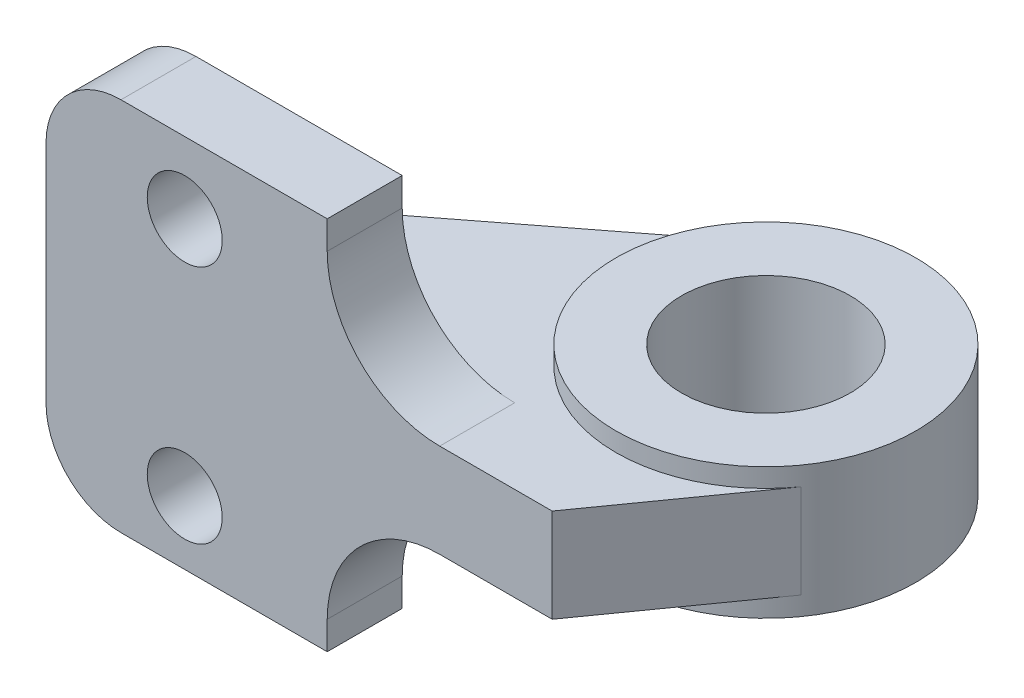
ISO-10303-21;
HEADER;
FILE_DESCRIPTION(('STEP AP214'),'2;1');
FILE_NAME('part.step','',(''),(''),'','','');
FILE_SCHEMA(('AUTOMOTIVE_DESIGN { 1 0 10303 214 1 1 1 1 }'));
ENDSEC;
DATA;
#1=APPLICATION_CONTEXT('core data for automotive mechanical design processes');
#2=APPLICATION_PROTOCOL_DEFINITION('international standard','automotive_design',2000,#1);
#3=PRODUCT_CONTEXT('',#1,'mechanical');
#4=PRODUCT('Part','Part','',(#3));
#5=PRODUCT_RELATED_PRODUCT_CATEGORY('part','',(#4));
#6=PRODUCT_DEFINITION_FORMATION('','',#4);
#7=PRODUCT_DEFINITION_CONTEXT('part definition',#1,'design');
#8=PRODUCT_DEFINITION('design','',#6,#7);
#9=PRODUCT_DEFINITION_SHAPE('','',#8);
#10=(LENGTH_UNIT() NAMED_UNIT(*) SI_UNIT(.MILLI.,.METRE.));
#11=(NAMED_UNIT(*) PLANE_ANGLE_UNIT() SI_UNIT($,.RADIAN.));
#12=(NAMED_UNIT(*) SI_UNIT($,.STERADIAN.) SOLID_ANGLE_UNIT());
#13=UNCERTAINTY_MEASURE_WITH_UNIT(LENGTH_MEASURE(1.E-05),#10,'distance_accuracy_value','');
#14=(GEOMETRIC_REPRESENTATION_CONTEXT(3) GLOBAL_UNCERTAINTY_ASSIGNED_CONTEXT((#13)) GLOBAL_UNIT_ASSIGNED_CONTEXT((#10,
#11,#12)) REPRESENTATION_CONTEXT('',''));
#15=CARTESIAN_POINT('',(0.,0.,0.));
#16=DIRECTION('',(0.,0.,1.));
#17=DIRECTION('',(1.,0.,0.));
#18=AXIS2_PLACEMENT_3D('',#15,#16,#17);
#19=CARTESIAN_POINT('',(37.5,0.,20.));
#20=DIRECTION('',(-1.,0.,0.));
#21=DIRECTION('',(0.,0.,1.));
#22=AXIS2_PLACEMENT_3D('',#19,#20,#21);
#23=PLANE('',#22);
#24=DIRECTION('',(0.,1.,0.));
#25=VECTOR('',#24,1.);
#26=CARTESIAN_POINT('',(37.5,50.,0.));
#27=LINE('',#26,#25);
#28=CARTESIAN_POINT('',(37.5,-50.,0.));
#29=VERTEX_POINT('',#28);
#30=CARTESIAN_POINT('',(37.5,-42.5,0.));
#31=VERTEX_POINT('',#30);
#32=EDGE_CURVE('E200',#29,#31,#27,.T.);
#33=ORIENTED_EDGE('',*,*,#32,.T.);
#34=DIRECTION('',(0.,0.,1.));
#35=VECTOR('',#34,1.);
#36=CARTESIAN_POINT('',(37.5,-42.5,20.));
#37=LINE('',#36,#35);
#38=CARTESIAN_POINT('',(37.5,-42.5,20.));
#39=VERTEX_POINT('',#38);
#40=EDGE_CURVE('E247',#31,#39,#37,.T.);
#41=ORIENTED_EDGE('',*,*,#40,.T.);
#42=DIRECTION('',(0.,1.,0.));
#43=VECTOR('',#42,1.);
#44=CARTESIAN_POINT('',(37.5,0.,20.));
#45=LINE('',#44,#43);
#46=CARTESIAN_POINT('',(37.5,-50.,20.));
#47=VERTEX_POINT('',#46);
#48=EDGE_CURVE('E181',#47,#39,#45,.T.);
#49=ORIENTED_EDGE('',*,*,#48,.F.);
#50=DIRECTION('',(0.,0.,-1.));
#51=VECTOR('',#50,1.);
#52=CARTESIAN_POINT('',(37.5,-50.,20.));
#53=LINE('',#52,#51);
#54=EDGE_CURVE('E199',#47,#29,#53,.T.);
#55=ORIENTED_EDGE('',*,*,#54,.T.);
#56=EDGE_LOOP('',(#33,#41,#49,#55));
#57=FACE_BOUND('',#56,.T.);
#58=ADVANCED_FACE('F41',(#57),#23,.F.);
#59=CARTESIAN_POINT('',(37.5,0.,0.));
#60=DIRECTION('',(0.,0.,1.));
#61=DIRECTION('',(1.,0.,0.));
#62=AXIS2_PLACEMENT_3D('',#59,#60,#61);
#63=PLANE('',#62);
#64=CARTESIAN_POINT('',(-0.499999999999999,-33.,0.));
#65=DIRECTION('',(0.,0.,-1.));
#66=DIRECTION('',(-1.,0.,0.));
#67=AXIS2_PLACEMENT_3D('',#64,#65,#66);
#68=CIRCLE('',#67,10.);
#69=CARTESIAN_POINT('',(-10.5,-33.,0.));
#70=VERTEX_POINT('',#69);
#71=EDGE_CURVE('E564',#70,#70,#68,.T.);
#72=ORIENTED_EDGE('',*,*,#71,.F.);
#73=EDGE_LOOP('',(#72));
#74=FACE_BOUND('',#73,.T.);
#75=CARTESIAN_POINT('',(-0.500000000000014,31.,0.));
#76=DIRECTION('',(0.,0.,-1.));
#77=DIRECTION('',(-1.,0.,0.));
#78=AXIS2_PLACEMENT_3D('',#75,#76,#77);
#79=CIRCLE('',#78,10.);
#80=CARTESIAN_POINT('',(-10.5,31.,0.));
#81=VERTEX_POINT('',#80);
#82=EDGE_CURVE('E309',#81,#81,#79,.T.);
#83=ORIENTED_EDGE('',*,*,#82,.F.);
#84=EDGE_LOOP('',(#83));
#85=FACE_BOUND('',#84,.T.);
#86=DIRECTION('',(1.,0.,0.));
#87=VECTOR('',#86,1.);
#88=CARTESIAN_POINT('',(-37.5,-50.,0.));
#89=LINE('',#88,#87);
#90=CARTESIAN_POINT('',(-17.5,-50.,0.));
#91=VERTEX_POINT('',#90);
#92=EDGE_CURVE('E192',#91,#29,#89,.T.);
#93=ORIENTED_EDGE('',*,*,#92,.F.);
#94=CARTESIAN_POINT('',(-17.5,-30.,0.));
#95=DIRECTION('',(0.,0.,1.));
#96=DIRECTION('',(1.,0.,0.));
#97=AXIS2_PLACEMENT_3D('',#94,#95,#96);
#98=CIRCLE('',#97,20.);
#99=CARTESIAN_POINT('',(-37.5,-30.,0.));
#100=VERTEX_POINT('',#99);
#101=EDGE_CURVE('E228',#91,#100,#98,.F.);
#102=ORIENTED_EDGE('',*,*,#101,.T.);
#103=DIRECTION('',(0.,-1.,0.));
#104=VECTOR('',#103,1.);
#105=CARTESIAN_POINT('',(-37.5,50.,0.));
#106=LINE('',#105,#104);
#107=CARTESIAN_POINT('',(-37.5,30.,0.));
#108=VERTEX_POINT('',#107);
#109=EDGE_CURVE('E209',#108,#100,#106,.T.);
#110=ORIENTED_EDGE('',*,*,#109,.F.);
#111=CARTESIAN_POINT('',(-17.5,30.,0.));
#112=DIRECTION('',(0.,0.,1.));
#113=DIRECTION('',(1.,0.,0.));
#114=AXIS2_PLACEMENT_3D('',#111,#112,#113);
#115=CIRCLE('',#114,20.);
#116=CARTESIAN_POINT('',(-17.5,50.,0.));
#117=VERTEX_POINT('',#116);
#118=EDGE_CURVE('E225',#108,#117,#115,.F.);
#119=ORIENTED_EDGE('',*,*,#118,.T.);
#120=DIRECTION('',(-1.,0.,0.));
#121=VECTOR('',#120,1.);
#122=CARTESIAN_POINT('',(-37.5,50.,0.));
#123=LINE('',#122,#121);
#124=CARTESIAN_POINT('',(37.5,50.,0.));
#125=VERTEX_POINT('',#124);
#126=EDGE_CURVE('E204',#125,#117,#123,.T.);
#127=ORIENTED_EDGE('',*,*,#126,.F.);
#128=CARTESIAN_POINT('',(37.5,42.5,0.));
#129=VERTEX_POINT('',#128);
#130=EDGE_CURVE('E205',#129,#125,#27,.T.);
#131=ORIENTED_EDGE('',*,*,#130,.F.);
#132=CARTESIAN_POINT('',(67.5,42.5,0.));
#133=DIRECTION('',(0.,0.,1.));
#134=DIRECTION('',(1.,0.,0.));
#135=AXIS2_PLACEMENT_3D('',#132,#133,#134);
#136=CIRCLE('',#135,30.);
#137=CARTESIAN_POINT('',(67.5,12.5,0.));
#138=VERTEX_POINT('',#137);
#139=EDGE_CURVE('E12',#129,#138,#136,.T.);
#140=ORIENTED_EDGE('',*,*,#139,.T.);
#141=DIRECTION('',(1.,0.,0.));
#142=VECTOR('',#141,1.);
#143=CARTESIAN_POINT('',(56.3290228548954,12.5,0.));
#144=LINE('',#143,#142);
#145=CARTESIAN_POINT('',(-27.5,12.5,0.));
#146=VERTEX_POINT('',#145);
#147=EDGE_CURVE('E57',#146,#138,#144,.T.);
#148=ORIENTED_EDGE('',*,*,#147,.F.);
#149=DIRECTION('',(0.,1.,0.));
#150=VECTOR('',#149,1.);
#151=CARTESIAN_POINT('',(-27.5,0.,0.));
#152=LINE('',#151,#150);
#153=CARTESIAN_POINT('',(-27.5,-12.5,0.));
#154=VERTEX_POINT('',#153);
#155=EDGE_CURVE('E148',#154,#146,#152,.T.);
#156=ORIENTED_EDGE('',*,*,#155,.F.);
#157=DIRECTION('',(1.,0.,0.));
#158=VECTOR('',#157,1.);
#159=CARTESIAN_POINT('',(56.3290228548954,-12.5,0.));
#160=LINE('',#159,#158);
#161=CARTESIAN_POINT('',(67.5,-12.5,0.));
#162=VERTEX_POINT('',#161);
#163=EDGE_CURVE('E64',#154,#162,#160,.T.);
#164=ORIENTED_EDGE('',*,*,#163,.T.);
#165=CARTESIAN_POINT('',(67.5,-42.5,0.));
#166=DIRECTION('',(0.,0.,1.));
#167=DIRECTION('',(1.,0.,0.));
#168=AXIS2_PLACEMENT_3D('',#165,#166,#167);
#169=CIRCLE('',#168,30.);
#170=EDGE_CURVE('E262',#162,#31,#169,.T.);
#171=ORIENTED_EDGE('',*,*,#170,.T.);
#172=ORIENTED_EDGE('',*,*,#32,.F.);
#173=EDGE_LOOP('',(#93,#102,#110,#119,#127,#131,#140,#148,#156,#164,#171,#172));
#174=FACE_BOUND('',#173,.T.);
#175=ADVANCED_FACE('F166',(#74,#85,#174),#63,.F.);
#176=CARTESIAN_POINT('',(37.5,42.5,20.));
#177=VERTEX_POINT('',#176);
#178=CARTESIAN_POINT('',(37.5,50.,20.));
#179=VERTEX_POINT('',#178);
#180=EDGE_CURVE('E186',#177,#179,#45,.T.);
#181=ORIENTED_EDGE('',*,*,#180,.F.);
#182=DIRECTION('',(0.,0.,1.));
#183=VECTOR('',#182,1.);
#184=CARTESIAN_POINT('',(37.5,42.5,20.));
#185=LINE('',#184,#183);
#186=EDGE_CURVE('E256',#177,#129,#185,.F.);
#187=ORIENTED_EDGE('',*,*,#186,.T.);
#188=ORIENTED_EDGE('',*,*,#130,.T.);
#189=DIRECTION('',(0.,0.,-1.));
#190=VECTOR('',#189,1.);
#191=CARTESIAN_POINT('',(37.5,50.,20.));
#192=LINE('',#191,#190);
#193=EDGE_CURVE('E218',#179,#125,#192,.T.);
#194=ORIENTED_EDGE('',*,*,#193,.F.);
#195=EDGE_LOOP('',(#181,#187,#188,#194));
#196=FACE_BOUND('',#195,.T.);
#197=ADVANCED_FACE('F276',(#196),#23,.F.);
#198=CARTESIAN_POINT('',(0.,0.,20.));
#199=DIRECTION('',(0.,0.,1.));
#200=DIRECTION('',(1.,0.,0.));
#201=AXIS2_PLACEMENT_3D('',#198,#199,#200);
#202=PLANE('',#201);
#203=CARTESIAN_POINT('',(-0.499999999999997,-33.,20.));
#204=DIRECTION('',(0.,0.,-1.));
#205=DIRECTION('',(-1.,0.,0.));
#206=AXIS2_PLACEMENT_3D('',#203,#204,#205);
#207=CIRCLE('',#206,10.);
#208=CARTESIAN_POINT('',(-10.5,-33.,20.));
#209=VERTEX_POINT('',#208);
#210=EDGE_CURVE('E560',#209,#209,#207,.T.);
#211=ORIENTED_EDGE('',*,*,#210,.T.);
#212=EDGE_LOOP('',(#211));
#213=FACE_BOUND('',#212,.T.);
#214=CARTESIAN_POINT('',(-0.500000000000012,31.,20.));
#215=DIRECTION('',(0.,0.,-1.));
#216=DIRECTION('',(-1.,0.,0.));
#217=AXIS2_PLACEMENT_3D('',#214,#215,#216);
#218=CIRCLE('',#217,10.);
#219=CARTESIAN_POINT('',(-10.5,31.,20.));
#220=VERTEX_POINT('',#219);
#221=EDGE_CURVE('E163',#220,#220,#218,.T.);
#222=ORIENTED_EDGE('',*,*,#221,.T.);
#223=EDGE_LOOP('',(#222));
#224=FACE_BOUND('',#223,.T.);
#225=DIRECTION('',(0.,-1.,0.));
#226=VECTOR('',#225,1.);
#227=CARTESIAN_POINT('',(-37.5,50.,20.));
#228=LINE('',#227,#226);
#229=CARTESIAN_POINT('',(-37.5,30.,20.));
#230=VERTEX_POINT('',#229);
#231=CARTESIAN_POINT('',(-37.5,-30.,20.));
#232=VERTEX_POINT('',#231);
#233=EDGE_CURVE('E191',#230,#232,#228,.T.);
#234=ORIENTED_EDGE('',*,*,#233,.T.);
#235=CARTESIAN_POINT('',(-17.5,-30.,20.));
#236=DIRECTION('',(0.,0.,1.));
#237=DIRECTION('',(1.,0.,0.));
#238=AXIS2_PLACEMENT_3D('',#235,#236,#237);
#239=CIRCLE('',#238,20.);
#240=CARTESIAN_POINT('',(-17.5,-50.,20.));
#241=VERTEX_POINT('',#240);
#242=EDGE_CURVE('E241',#232,#241,#239,.T.);
#243=ORIENTED_EDGE('',*,*,#242,.T.);
#244=DIRECTION('',(1.,0.,0.));
#245=VECTOR('',#244,1.);
#246=CARTESIAN_POINT('',(-37.5,-50.,20.));
#247=LINE('',#246,#245);
#248=EDGE_CURVE('E196',#241,#47,#247,.T.);
#249=ORIENTED_EDGE('',*,*,#248,.T.);
#250=ORIENTED_EDGE('',*,*,#48,.T.);
#251=CARTESIAN_POINT('',(67.5,-42.5,20.));
#252=DIRECTION('',(0.,0.,1.));
#253=DIRECTION('',(1.,0.,0.));
#254=AXIS2_PLACEMENT_3D('',#251,#252,#253);
#255=CIRCLE('',#254,30.);
#256=CARTESIAN_POINT('',(67.5,-12.5,20.));
#257=VERTEX_POINT('',#256);
#258=EDGE_CURVE('E259',#39,#257,#255,.F.);
#259=ORIENTED_EDGE('',*,*,#258,.T.);
#260=DIRECTION('',(1.,0.,0.));
#261=VECTOR('',#260,1.);
#262=CARTESIAN_POINT('',(56.3290228548954,-12.5,20.));
#263=LINE('',#262,#261);
#264=CARTESIAN_POINT('',(97.5,-12.5,20.));
#265=VERTEX_POINT('',#264);
#266=EDGE_CURVE('E153',#257,#265,#263,.T.);
#267=ORIENTED_EDGE('',*,*,#266,.T.);
#268=DIRECTION('',(0.,1.,0.));
#269=VECTOR('',#268,1.);
#270=CARTESIAN_POINT('',(97.5,0.,20.));
#271=LINE('',#270,#269);
#272=CARTESIAN_POINT('',(97.5,12.5,20.));
#273=VERTEX_POINT('',#272);
#274=EDGE_CURVE('E168',#265,#273,#271,.T.);
#275=ORIENTED_EDGE('',*,*,#274,.T.);
#276=DIRECTION('',(1.,0.,0.));
#277=VECTOR('',#276,1.);
#278=CARTESIAN_POINT('',(56.3290228548954,12.5,20.));
#279=LINE('',#278,#277);
#280=CARTESIAN_POINT('',(67.5,12.5,20.));
#281=VERTEX_POINT('',#280);
#282=EDGE_CURVE('E270',#281,#273,#279,.T.);
#283=ORIENTED_EDGE('',*,*,#282,.F.);
#284=CARTESIAN_POINT('',(67.5,42.5,20.));
#285=DIRECTION('',(0.,0.,1.));
#286=DIRECTION('',(1.,0.,0.));
#287=AXIS2_PLACEMENT_3D('',#284,#285,#286);
#288=CIRCLE('',#287,30.);
#289=EDGE_CURVE('E50',#281,#177,#288,.F.);
#290=ORIENTED_EDGE('',*,*,#289,.T.);
#291=ORIENTED_EDGE('',*,*,#180,.T.);
#292=DIRECTION('',(-1.,0.,0.));
#293=VECTOR('',#292,1.);
#294=CARTESIAN_POINT('',(-37.5,50.,20.));
#295=LINE('',#294,#293);
#296=CARTESIAN_POINT('',(-17.5,50.,20.));
#297=VERTEX_POINT('',#296);
#298=EDGE_CURVE('E187',#179,#297,#295,.T.);
#299=ORIENTED_EDGE('',*,*,#298,.T.);
#300=CARTESIAN_POINT('',(-17.5,30.,20.));
#301=DIRECTION('',(0.,0.,1.));
#302=DIRECTION('',(1.,0.,0.));
#303=AXIS2_PLACEMENT_3D('',#300,#301,#302);
#304=CIRCLE('',#303,20.);
#305=EDGE_CURVE('E238',#297,#230,#304,.T.);
#306=ORIENTED_EDGE('',*,*,#305,.T.);
#307=EDGE_LOOP('',(#234,#243,#249,#250,#259,#267,#275,#283,#290,#291,#299,#306));
#308=FACE_BOUND('',#307,.T.);
#309=ADVANCED_FACE('F268',(#213,#224,#308),#202,.T.);
#310=CARTESIAN_POINT('',(-37.5,50.,20.));
#311=DIRECTION('',(0.,-1.,0.));
#312=DIRECTION('',(1.,0.,0.));
#313=AXIS2_PLACEMENT_3D('',#310,#311,#312);
#314=PLANE('',#313);
#315=ORIENTED_EDGE('',*,*,#126,.T.);
#316=DIRECTION('',(0.,0.,-1.));
#317=VECTOR('',#316,1.);
#318=CARTESIAN_POINT('',(-17.5,50.,20.));
#319=LINE('',#318,#317);
#320=EDGE_CURVE('E244',#117,#297,#319,.F.);
#321=ORIENTED_EDGE('',*,*,#320,.T.);
#322=ORIENTED_EDGE('',*,*,#298,.F.);
#323=ORIENTED_EDGE('',*,*,#193,.T.);
#324=EDGE_LOOP('',(#315,#321,#322,#323));
#325=FACE_BOUND('',#324,.T.);
#326=ADVANCED_FACE('F355',(#325),#314,.F.);
#327=CARTESIAN_POINT('',(-37.5,50.,20.));
#328=DIRECTION('',(1.,0.,0.));
#329=DIRECTION('',(0.,1.,0.));
#330=AXIS2_PLACEMENT_3D('',#327,#328,#329);
#331=PLANE('',#330);
#332=ORIENTED_EDGE('',*,*,#109,.T.);
#333=DIRECTION('',(0.,0.,-1.));
#334=VECTOR('',#333,1.);
#335=CARTESIAN_POINT('',(-37.5,-30.,20.));
#336=LINE('',#335,#334);
#337=EDGE_CURVE('E235',#100,#232,#336,.F.);
#338=ORIENTED_EDGE('',*,*,#337,.T.);
#339=ORIENTED_EDGE('',*,*,#233,.F.);
#340=DIRECTION('',(0.,0.,-1.));
#341=VECTOR('',#340,1.);
#342=CARTESIAN_POINT('',(-37.5,30.,20.));
#343=LINE('',#342,#341);
#344=EDGE_CURVE('E231',#230,#108,#343,.T.);
#345=ORIENTED_EDGE('',*,*,#344,.T.);
#346=EDGE_LOOP('',(#332,#338,#339,#345));
#347=FACE_BOUND('',#346,.T.);
#348=ADVANCED_FACE('F345',(#347),#331,.F.);
#349=CARTESIAN_POINT('',(-37.5,-50.,20.));
#350=DIRECTION('',(0.,1.,0.));
#351=DIRECTION('',(0.,0.,1.));
#352=AXIS2_PLACEMENT_3D('',#349,#350,#351);
#353=PLANE('',#352);
#354=ORIENTED_EDGE('',*,*,#248,.F.);
#355=DIRECTION('',(0.,0.,-1.));
#356=VECTOR('',#355,1.);
#357=CARTESIAN_POINT('',(-17.5,-50.,20.));
#358=LINE('',#357,#356);
#359=EDGE_CURVE('E185',#241,#91,#358,.T.);
#360=ORIENTED_EDGE('',*,*,#359,.T.);
#361=ORIENTED_EDGE('',*,*,#92,.T.);
#362=ORIENTED_EDGE('',*,*,#54,.F.);
#363=EDGE_LOOP('',(#354,#360,#361,#362));
#364=FACE_BOUND('',#363,.T.);
#365=ADVANCED_FACE('F339',(#364),#353,.F.);
#366=CARTESIAN_POINT('',(92.5,17.5,-42.));
#367=DIRECTION('',(0.,-1.,0.));
#368=DIRECTION('',(0.,0.,-1.));
#369=AXIS2_PLACEMENT_3D('',#366,#367,#368);
#370=CYLINDRICAL_SURFACE('',#369,22.5);
#371=CARTESIAN_POINT('',(92.5,17.5,-42.));
#372=DIRECTION('',(0.,1.,0.));
#373=DIRECTION('',(0.,0.,1.));
#374=AXIS2_PLACEMENT_3D('',#371,#372,#373);
#375=CIRCLE('',#374,22.5);
#376=CARTESIAN_POINT('',(92.5,17.5,-19.5));
#377=VERTEX_POINT('',#376);
#378=EDGE_CURVE('E316',#377,#377,#375,.T.);
#379=ORIENTED_EDGE('',*,*,#378,.T.);
#380=EDGE_LOOP('',(#379));
#381=FACE_BOUND('',#380,.T.);
#382=CARTESIAN_POINT('',(92.5,-17.5,-42.));
#383=DIRECTION('',(0.,1.,0.));
#384=DIRECTION('',(0.,0.,1.));
#385=AXIS2_PLACEMENT_3D('',#382,#383,#384);
#386=CIRCLE('',#385,22.5);
#387=CARTESIAN_POINT('',(92.5,-17.5,-19.5));
#388=VERTEX_POINT('',#387);
#389=EDGE_CURVE('E320',#388,#388,#386,.T.);
#390=ORIENTED_EDGE('',*,*,#389,.F.);
#391=EDGE_LOOP('',(#390));
#392=FACE_BOUND('',#391,.T.);
#393=ADVANCED_FACE('F365',(#381,#392),#370,.F.);
#394=CARTESIAN_POINT('',(92.5,-17.5,-42.));
#395=DIRECTION('',(0.,1.,0.));
#396=DIRECTION('',(0.,0.,1.));
#397=AXIS2_PLACEMENT_3D('',#394,#395,#396);
#398=PLANE('',#397);
#399=CARTESIAN_POINT('',(92.5,-17.5,-42.));
#400=DIRECTION('',(0.,1.,0.));
#401=DIRECTION('',(0.,0.,1.));
#402=AXIS2_PLACEMENT_3D('',#399,#400,#401);
#403=CIRCLE('',#402,40.);
#404=CARTESIAN_POINT('',(92.5,-17.5,-1.99999999999999));
#405=VERTEX_POINT('',#404);
#406=EDGE_CURVE('E312',#405,#405,#403,.T.);
#407=ORIENTED_EDGE('',*,*,#406,.F.);
#408=EDGE_LOOP('',(#407));
#409=FACE_BOUND('',#408,.T.);
#410=ORIENTED_EDGE('',*,*,#389,.T.);
#411=EDGE_LOOP('',(#410));
#412=FACE_BOUND('',#411,.T.);
#413=ADVANCED_FACE('F383',(#409,#412),#398,.F.);
#414=CARTESIAN_POINT('',(92.5,17.5,-42.));
#415=DIRECTION('',(0.,1.,0.));
#416=DIRECTION('',(0.,0.,1.));
#417=AXIS2_PLACEMENT_3D('',#414,#415,#416);
#418=PLANE('',#417);
#419=CARTESIAN_POINT('',(92.5,17.5,-42.));
#420=DIRECTION('',(0.,1.,0.));
#421=DIRECTION('',(0.,0.,1.));
#422=AXIS2_PLACEMENT_3D('',#419,#420,#421);
#423=CIRCLE('',#422,40.);
#424=CARTESIAN_POINT('',(92.5,17.5,-1.99999999999999));
#425=VERTEX_POINT('',#424);
#426=EDGE_CURVE('E306',#425,#425,#423,.T.);
#427=ORIENTED_EDGE('',*,*,#426,.T.);
#428=EDGE_LOOP('',(#427));
#429=FACE_BOUND('',#428,.T.);
#430=ORIENTED_EDGE('',*,*,#378,.F.);
#431=EDGE_LOOP('',(#430));
#432=FACE_BOUND('',#431,.T.);
#433=ADVANCED_FACE('F389',(#429,#432),#418,.T.);
#434=CARTESIAN_POINT('',(97.5,0.,20.));
#435=DIRECTION('',(0.815019211741021,0.,0.579433934537014));
#436=DIRECTION('',(0.579433934537014,0.,-0.815019211741021));
#437=AXIS2_PLACEMENT_3D('',#434,#435,#436);
#438=PLANE('',#437);
#439=DIRECTION('',(0.,-1.,0.));
#440=VECTOR('',#439,1.);
#441=CARTESIAN_POINT('',(125.100768469641,17.5,-18.8226426185194));
#442=LINE('',#441,#440);
#443=CARTESIAN_POINT('',(125.100768469641,12.5,-18.8226426185194));
#444=VERTEX_POINT('',#443);
#445=CARTESIAN_POINT('',(125.100768469641,-12.5,-18.8226426185194));
#446=VERTEX_POINT('',#445);
#447=EDGE_CURVE('E162',#444,#446,#442,.T.);
#448=ORIENTED_EDGE('',*,*,#447,.F.);
#449=DIRECTION('',(0.579433934537014,0.,-0.815019211741021));
#450=VECTOR('',#449,1.);
#451=CARTESIAN_POINT('',(97.5,12.5,20.));
#452=LINE('',#451,#450);
#453=EDGE_CURVE('E154',#273,#444,#452,.T.);
#454=ORIENTED_EDGE('',*,*,#453,.F.);
#455=ORIENTED_EDGE('',*,*,#274,.F.);
#456=DIRECTION('',(0.579433934537014,0.,-0.815019211741021));
#457=VECTOR('',#456,1.);
#458=CARTESIAN_POINT('',(97.5,-12.5,20.));
#459=LINE('',#458,#457);
#460=EDGE_CURVE('E282',#265,#446,#459,.T.);
#461=ORIENTED_EDGE('',*,*,#460,.T.);
#462=EDGE_LOOP('',(#448,#454,#455,#461));
#463=FACE_BOUND('',#462,.T.);
#464=ADVANCED_FACE('F301',(#463),#438,.T.);
#465=CARTESIAN_POINT('',(92.5,17.5,-42.));
#466=DIRECTION('',(0.,-1.,0.));
#467=DIRECTION('',(0.,0.,-1.));
#468=AXIS2_PLACEMENT_3D('',#465,#466,#467);
#469=CYLINDRICAL_SURFACE('',#468,40.);
#470=CARTESIAN_POINT('',(92.5,12.5,-42.));
#471=DIRECTION('',(0.,1.,0.));
#472=DIRECTION('',(0.,0.,1.));
#473=AXIS2_PLACEMENT_3D('',#470,#471,#472);
#474=CIRCLE('',#473,40.);
#475=CARTESIAN_POINT('',(68.0787707330875,12.5,-73.6797026673689));
#476=VERTEX_POINT('',#475);
#477=EDGE_CURVE('E176',#476,#444,#474,.T.);
#478=ORIENTED_EDGE('',*,*,#477,.T.);
#479=ORIENTED_EDGE('',*,*,#447,.T.);
#480=CARTESIAN_POINT('',(92.5,-12.5,-42.));
#481=DIRECTION('',(0.,1.,0.));
#482=DIRECTION('',(0.,0.,1.));
#483=AXIS2_PLACEMENT_3D('',#480,#481,#482);
#484=CIRCLE('',#483,40.);
#485=CARTESIAN_POINT('',(68.0787707330875,-12.5,-73.6797026673689));
#486=VERTEX_POINT('',#485);
#487=EDGE_CURVE('E169',#486,#446,#484,.T.);
#488=ORIENTED_EDGE('',*,*,#487,.F.);
#489=DIRECTION('',(0.,-1.,0.));
#490=VECTOR('',#489,1.);
#491=CARTESIAN_POINT('',(68.0787707330875,17.5,-73.6797026673689));
#492=LINE('',#491,#490);
#493=EDGE_CURVE('E149',#476,#486,#492,.T.);
#494=ORIENTED_EDGE('',*,*,#493,.F.);
#495=EDGE_LOOP('',(#478,#479,#488,#494));
#496=FACE_BOUND('',#495,.T.);
#497=ORIENTED_EDGE('',*,*,#426,.F.);
#498=EDGE_LOOP('',(#497));
#499=FACE_BOUND('',#498,.T.);
#500=ORIENTED_EDGE('',*,*,#406,.T.);
#501=EDGE_LOOP('',(#500));
#502=FACE_BOUND('',#501,.T.);
#503=ADVANCED_FACE('F328',(#496,#499,#502),#469,.T.);
#504=CARTESIAN_POINT('',(-27.5,0.,0.));
#505=DIRECTION('',(-0.610530731672811,0.,-0.791992566684222));
#506=DIRECTION('',(-0.791992566684222,0.,0.610530731672811));
#507=AXIS2_PLACEMENT_3D('',#504,#505,#506);
#508=PLANE('',#507);
#509=DIRECTION('',(-0.791992566684222,0.,0.610530731672811));
#510=VECTOR('',#509,1.);
#511=CARTESIAN_POINT('',(-27.5,12.5,0.));
#512=LINE('',#511,#510);
#513=EDGE_CURVE('E174',#476,#146,#512,.T.);
#514=ORIENTED_EDGE('',*,*,#513,.F.);
#515=ORIENTED_EDGE('',*,*,#493,.T.);
#516=DIRECTION('',(-0.791992566684222,0.,0.610530731672811));
#517=VECTOR('',#516,1.);
#518=CARTESIAN_POINT('',(-27.5,-12.5,0.));
#519=LINE('',#518,#517);
#520=EDGE_CURVE('E145',#486,#154,#519,.T.);
#521=ORIENTED_EDGE('',*,*,#520,.T.);
#522=ORIENTED_EDGE('',*,*,#155,.T.);
#523=EDGE_LOOP('',(#514,#515,#521,#522));
#524=FACE_BOUND('',#523,.T.);
#525=ADVANCED_FACE('F147',(#524),#508,.T.);
#526=CARTESIAN_POINT('',(56.3290228548954,-12.5,-29.4516656193891));
#527=DIRECTION('',(0.,1.,0.));
#528=DIRECTION('',(0.,0.,1.));
#529=AXIS2_PLACEMENT_3D('',#526,#527,#528);
#530=PLANE('',#529);
#531=ORIENTED_EDGE('',*,*,#266,.F.);
#532=DIRECTION('',(0.,0.,1.));
#533=VECTOR('',#532,1.);
#534=CARTESIAN_POINT('',(67.5,-12.5,0.));
#535=LINE('',#534,#533);
#536=EDGE_CURVE('E159',#257,#162,#535,.F.);
#537=ORIENTED_EDGE('',*,*,#536,.T.);
#538=ORIENTED_EDGE('',*,*,#163,.F.);
#539=ORIENTED_EDGE('',*,*,#520,.F.);
#540=ORIENTED_EDGE('',*,*,#487,.T.);
#541=ORIENTED_EDGE('',*,*,#460,.F.);
#542=EDGE_LOOP('',(#531,#537,#538,#539,#540,#541));
#543=FACE_BOUND('',#542,.T.);
#544=ADVANCED_FACE('F157',(#543),#530,.F.);
#545=CARTESIAN_POINT('',(56.3290228548954,12.5,-29.4516656193891));
#546=DIRECTION('',(0.,1.,0.));
#547=DIRECTION('',(0.,0.,1.));
#548=AXIS2_PLACEMENT_3D('',#545,#546,#547);
#549=PLANE('',#548);
#550=ORIENTED_EDGE('',*,*,#147,.T.);
#551=DIRECTION('',(0.,0.,1.));
#552=VECTOR('',#551,1.);
#553=CARTESIAN_POINT('',(67.5,12.5,-29.4516656193891));
#554=LINE('',#553,#552);
#555=EDGE_CURVE('E253',#138,#281,#554,.T.);
#556=ORIENTED_EDGE('',*,*,#555,.T.);
#557=ORIENTED_EDGE('',*,*,#282,.T.);
#558=ORIENTED_EDGE('',*,*,#453,.T.);
#559=ORIENTED_EDGE('',*,*,#477,.F.);
#560=ORIENTED_EDGE('',*,*,#513,.T.);
#561=EDGE_LOOP('',(#550,#556,#557,#558,#559,#560));
#562=FACE_BOUND('',#561,.T.);
#563=ADVANCED_FACE('F300',(#562),#549,.T.);
#564=CARTESIAN_POINT('',(-17.5,-30.,20.));
#565=DIRECTION('',(0.,0.,-1.));
#566=DIRECTION('',(-1.,0.,0.));
#567=AXIS2_PLACEMENT_3D('',#564,#565,#566);
#568=CYLINDRICAL_SURFACE('',#567,20.);
#569=ORIENTED_EDGE('',*,*,#242,.F.);
#570=ORIENTED_EDGE('',*,*,#337,.F.);
#571=ORIENTED_EDGE('',*,*,#101,.F.);
#572=ORIENTED_EDGE('',*,*,#359,.F.);
#573=EDGE_LOOP('',(#569,#570,#571,#572));
#574=FACE_BOUND('',#573,.T.);
#575=ADVANCED_FACE('F349',(#574),#568,.T.);
#576=CARTESIAN_POINT('',(-17.5,30.,20.));
#577=DIRECTION('',(0.,0.,-1.));
#578=DIRECTION('',(-1.,0.,0.));
#579=AXIS2_PLACEMENT_3D('',#576,#577,#578);
#580=CYLINDRICAL_SURFACE('',#579,20.);
#581=ORIENTED_EDGE('',*,*,#305,.F.);
#582=ORIENTED_EDGE('',*,*,#320,.F.);
#583=ORIENTED_EDGE('',*,*,#118,.F.);
#584=ORIENTED_EDGE('',*,*,#344,.F.);
#585=EDGE_LOOP('',(#581,#582,#583,#584));
#586=FACE_BOUND('',#585,.T.);
#587=ADVANCED_FACE('F352',(#586),#580,.T.);
#588=CARTESIAN_POINT('',(67.5,-42.5,20.));
#589=DIRECTION('',(0.,0.,-1.));
#590=DIRECTION('',(-1.,0.,0.));
#591=AXIS2_PLACEMENT_3D('',#588,#589,#590);
#592=CYLINDRICAL_SURFACE('',#591,30.);
#593=ORIENTED_EDGE('',*,*,#170,.F.);
#594=ORIENTED_EDGE('',*,*,#536,.F.);
#595=ORIENTED_EDGE('',*,*,#258,.F.);
#596=ORIENTED_EDGE('',*,*,#40,.F.);
#597=EDGE_LOOP('',(#593,#594,#595,#596));
#598=FACE_BOUND('',#597,.T.);
#599=ADVANCED_FACE('F331',(#598),#592,.F.);
#600=CARTESIAN_POINT('',(67.5,42.5,-29.4516656193891));
#601=DIRECTION('',(0.,0.,1.));
#602=DIRECTION('',(1.,0.,0.));
#603=AXIS2_PLACEMENT_3D('',#600,#601,#602);
#604=CYLINDRICAL_SURFACE('',#603,30.);
#605=ORIENTED_EDGE('',*,*,#139,.F.);
#606=ORIENTED_EDGE('',*,*,#186,.F.);
#607=ORIENTED_EDGE('',*,*,#289,.F.);
#608=ORIENTED_EDGE('',*,*,#555,.F.);
#609=EDGE_LOOP('',(#605,#606,#607,#608));
#610=FACE_BOUND('',#609,.T.);
#611=ADVANCED_FACE('F43',(#610),#604,.F.);
#612=CARTESIAN_POINT('',(-0.500000000000012,31.,20.));
#613=DIRECTION('',(0.,0.,-1.));
#614=DIRECTION('',(-1.,0.,0.));
#615=AXIS2_PLACEMENT_3D('',#612,#613,#614);
#616=CYLINDRICAL_SURFACE('',#615,10.);
#617=ORIENTED_EDGE('',*,*,#221,.F.);
#618=EDGE_LOOP('',(#617));
#619=FACE_BOUND('',#618,.T.);
#620=ORIENTED_EDGE('',*,*,#82,.T.);
#621=EDGE_LOOP('',(#620));
#622=FACE_BOUND('',#621,.T.);
#623=ADVANCED_FACE('F412',(#619,#622),#616,.F.);
#624=CARTESIAN_POINT('',(-0.499999999999997,-33.,20.));
#625=DIRECTION('',(0.,0.,-1.));
#626=DIRECTION('',(-1.,0.,0.));
#627=AXIS2_PLACEMENT_3D('',#624,#625,#626);
#628=CYLINDRICAL_SURFACE('',#627,10.);
#629=ORIENTED_EDGE('',*,*,#210,.F.);
#630=EDGE_LOOP('',(#629));
#631=FACE_BOUND('',#630,.T.);
#632=ORIENTED_EDGE('',*,*,#71,.T.);
#633=EDGE_LOOP('',(#632));
#634=FACE_BOUND('',#633,.T.);
#635=ADVANCED_FACE('F416',(#631,#634),#628,.F.);
#636=CLOSED_SHELL('',(#58,#175,#197,#309,#326,#348,#365,#393,#413,#433,#464,#503,#525,#544,#563,
#575,#587,#599,#611,#623,#635));
#637=MANIFOLD_SOLID_BREP('B2',#636);
#638=ADVANCED_BREP_SHAPE_REPRESENTATION('',(#18,#637),#14);
#639=SHAPE_DEFINITION_REPRESENTATION(#9,#638);
ENDSEC;
END-ISO-10303-21;
